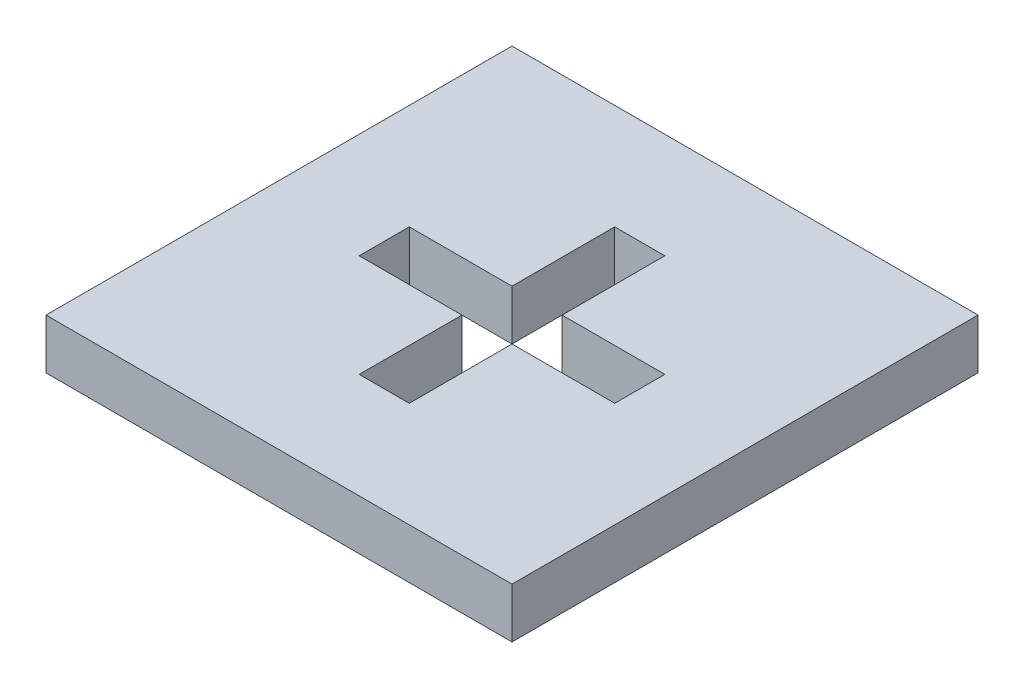
ISO-10303-21;
HEADER;
FILE_DESCRIPTION(('STEP AP214'),'2;1');
FILE_NAME('part.step','',(''),(''),'','','');
FILE_SCHEMA(('AUTOMOTIVE_DESIGN { 1 0 10303 214 1 1 1 1 }'));
ENDSEC;
DATA;
#1=APPLICATION_CONTEXT('core data for automotive mechanical design processes');
#2=APPLICATION_PROTOCOL_DEFINITION('international standard','automotive_design',2000,#1);
#3=PRODUCT_CONTEXT('',#1,'mechanical');
#4=PRODUCT('Part','Part','',(#3));
#5=PRODUCT_RELATED_PRODUCT_CATEGORY('part','',(#4));
#6=PRODUCT_DEFINITION_FORMATION('','',#4);
#7=PRODUCT_DEFINITION_CONTEXT('part definition',#1,'design');
#8=PRODUCT_DEFINITION('design','',#6,#7);
#9=PRODUCT_DEFINITION_SHAPE('','',#8);
#10=(LENGTH_UNIT() NAMED_UNIT(*) SI_UNIT(.MILLI.,.METRE.));
#11=(NAMED_UNIT(*) PLANE_ANGLE_UNIT() SI_UNIT($,.RADIAN.));
#12=(NAMED_UNIT(*) SI_UNIT($,.STERADIAN.) SOLID_ANGLE_UNIT());
#13=UNCERTAINTY_MEASURE_WITH_UNIT(LENGTH_MEASURE(1.E-05),#10,'distance_accuracy_value','');
#14=(GEOMETRIC_REPRESENTATION_CONTEXT(3) GLOBAL_UNCERTAINTY_ASSIGNED_CONTEXT((#13)) GLOBAL_UNIT_ASSIGNED_CONTEXT((#10,
#11,#12)) REPRESENTATION_CONTEXT('',''));
#15=CARTESIAN_POINT('',(0.,0.,0.));
#16=DIRECTION('',(0.,0.,1.));
#17=DIRECTION('',(1.,0.,0.));
#18=AXIS2_PLACEMENT_3D('',#15,#16,#17);
#19=CARTESIAN_POINT('',(0.,5.461,0.));
#20=DIRECTION('',(1.,0.,0.));
#21=DIRECTION('',(0.,0.,-1.));
#22=AXIS2_PLACEMENT_3D('',#19,#20,#21);
#23=PLANE('',#22);
#24=DIRECTION('',(0.,0.,1.));
#25=VECTOR('',#24,1.);
#26=CARTESIAN_POINT('',(0.,0.,0.));
#27=LINE('',#26,#25);
#28=CARTESIAN_POINT('',(0.,0.,-50.8));
#29=VERTEX_POINT('',#28);
#30=CARTESIAN_POINT('',(0.,0.,0.));
#31=VERTEX_POINT('',#30);
#32=EDGE_CURVE('E214',#29,#31,#27,.T.);
#33=ORIENTED_EDGE('',*,*,#32,.T.);
#34=DIRECTION('',(0.,-1.,0.));
#35=VECTOR('',#34,1.);
#36=CARTESIAN_POINT('',(0.,5.461,0.));
#37=LINE('',#36,#35);
#38=CARTESIAN_POINT('',(0.,5.461,0.));
#39=VERTEX_POINT('',#38);
#40=EDGE_CURVE('E12',#39,#31,#37,.T.);
#41=ORIENTED_EDGE('',*,*,#40,.F.);
#42=DIRECTION('',(0.,0.,1.));
#43=VECTOR('',#42,1.);
#44=CARTESIAN_POINT('',(0.,5.461,0.));
#45=LINE('',#44,#43);
#46=CARTESIAN_POINT('',(0.,5.461,-50.8));
#47=VERTEX_POINT('',#46);
#48=EDGE_CURVE('E234',#47,#39,#45,.T.);
#49=ORIENTED_EDGE('',*,*,#48,.F.);
#50=DIRECTION('',(0.,-1.,0.));
#51=VECTOR('',#50,1.);
#52=CARTESIAN_POINT('',(0.,5.461,-50.8));
#53=LINE('',#52,#51);
#54=EDGE_CURVE('E251',#47,#29,#53,.T.);
#55=ORIENTED_EDGE('',*,*,#54,.T.);
#56=EDGE_LOOP('',(#33,#41,#49,#55));
#57=FACE_BOUND('',#56,.T.);
#58=ADVANCED_FACE('F35',(#57),#23,.F.);
#59=CARTESIAN_POINT('',(0.,5.461,0.));
#60=DIRECTION('',(0.,0.,-1.));
#61=DIRECTION('',(-1.,0.,0.));
#62=AXIS2_PLACEMENT_3D('',#59,#60,#61);
#63=PLANE('',#62);
#64=DIRECTION('',(1.,0.,0.));
#65=VECTOR('',#64,1.);
#66=CARTESIAN_POINT('',(0.,0.,0.));
#67=LINE('',#66,#65);
#68=CARTESIAN_POINT('',(50.8,0.,0.));
#69=VERTEX_POINT('',#68);
#70=EDGE_CURVE('E254',#31,#69,#67,.T.);
#71=ORIENTED_EDGE('',*,*,#70,.T.);
#72=DIRECTION('',(0.,-1.,0.));
#73=VECTOR('',#72,1.);
#74=CARTESIAN_POINT('',(50.8,5.461,0.));
#75=LINE('',#74,#73);
#76=CARTESIAN_POINT('',(50.8,5.461,0.));
#77=VERTEX_POINT('',#76);
#78=EDGE_CURVE('E42',#77,#69,#75,.T.);
#79=ORIENTED_EDGE('',*,*,#78,.F.);
#80=DIRECTION('',(1.,0.,0.));
#81=VECTOR('',#80,1.);
#82=CARTESIAN_POINT('',(0.,5.461,0.));
#83=LINE('',#82,#81);
#84=EDGE_CURVE('E238',#39,#77,#83,.T.);
#85=ORIENTED_EDGE('',*,*,#84,.F.);
#86=ORIENTED_EDGE('',*,*,#40,.T.);
#87=EDGE_LOOP('',(#71,#79,#85,#86));
#88=FACE_BOUND('',#87,.T.);
#89=ADVANCED_FACE('F282',(#88),#63,.F.);
#90=CARTESIAN_POINT('',(50.8,5.461,0.));
#91=DIRECTION('',(-1.,0.,0.));
#92=DIRECTION('',(0.,0.,1.));
#93=AXIS2_PLACEMENT_3D('',#90,#91,#92);
#94=PLANE('',#93);
#95=DIRECTION('',(0.,0.,-1.));
#96=VECTOR('',#95,1.);
#97=CARTESIAN_POINT('',(50.8,0.,0.));
#98=LINE('',#97,#96);
#99=CARTESIAN_POINT('',(50.8,0.,-50.8));
#100=VERTEX_POINT('',#99);
#101=EDGE_CURVE('E256',#69,#100,#98,.T.);
#102=ORIENTED_EDGE('',*,*,#101,.T.);
#103=DIRECTION('',(0.,-1.,0.));
#104=VECTOR('',#103,1.);
#105=CARTESIAN_POINT('',(50.8,5.461,-50.8));
#106=LINE('',#105,#104);
#107=CARTESIAN_POINT('',(50.8,5.461,-50.8));
#108=VERTEX_POINT('',#107);
#109=EDGE_CURVE('E261',#108,#100,#106,.T.);
#110=ORIENTED_EDGE('',*,*,#109,.F.);
#111=DIRECTION('',(0.,0.,-1.));
#112=VECTOR('',#111,1.);
#113=CARTESIAN_POINT('',(50.8,5.461,0.));
#114=LINE('',#113,#112);
#115=EDGE_CURVE('E246',#77,#108,#114,.T.);
#116=ORIENTED_EDGE('',*,*,#115,.F.);
#117=ORIENTED_EDGE('',*,*,#78,.T.);
#118=EDGE_LOOP('',(#102,#110,#116,#117));
#119=FACE_BOUND('',#118,.T.);
#120=ADVANCED_FACE('F268',(#119),#94,.F.);
#121=CARTESIAN_POINT('',(0.,5.461,-50.8));
#122=DIRECTION('',(0.,0.,1.));
#123=DIRECTION('',(1.,0.,0.));
#124=AXIS2_PLACEMENT_3D('',#121,#122,#123);
#125=PLANE('',#124);
#126=DIRECTION('',(-1.,0.,0.));
#127=VECTOR('',#126,1.);
#128=CARTESIAN_POINT('',(0.,0.,-50.8));
#129=LINE('',#128,#127);
#130=EDGE_CURVE('E239',#100,#29,#129,.T.);
#131=ORIENTED_EDGE('',*,*,#130,.T.);
#132=ORIENTED_EDGE('',*,*,#54,.F.);
#133=DIRECTION('',(-1.,0.,0.));
#134=VECTOR('',#133,1.);
#135=CARTESIAN_POINT('',(0.,5.461,-50.8));
#136=LINE('',#135,#134);
#137=EDGE_CURVE('E248',#108,#47,#136,.T.);
#138=ORIENTED_EDGE('',*,*,#137,.F.);
#139=ORIENTED_EDGE('',*,*,#109,.T.);
#140=EDGE_LOOP('',(#131,#132,#138,#139));
#141=FACE_BOUND('',#140,.T.);
#142=ADVANCED_FACE('F275',(#141),#125,.F.);
#143=CARTESIAN_POINT('',(0.,5.461,0.));
#144=DIRECTION('',(0.,-1.,0.));
#145=DIRECTION('',(0.,0.,-1.));
#146=AXIS2_PLACEMENT_3D('',#143,#144,#145);
#147=PLANE('',#146);
#148=DIRECTION('',(-1.,0.,0.));
#149=VECTOR('',#148,1.);
#150=CARTESIAN_POINT('',(11.4723333333333,5.461,-28.1305));
#151=LINE('',#150,#149);
#152=CARTESIAN_POINT('',(22.6695,5.461,-28.1305));
#153=VERTEX_POINT('',#152);
#154=CARTESIAN_POINT('',(11.4723333333333,5.461,-28.1305));
#155=VERTEX_POINT('',#154);
#156=EDGE_CURVE('E199',#153,#155,#151,.T.);
#157=ORIENTED_EDGE('',*,*,#156,.F.);
#158=DIRECTION('',(0.,0.,1.));
#159=VECTOR('',#158,1.);
#160=CARTESIAN_POINT('',(22.6695,5.461,-39.3276666666666));
#161=LINE('',#160,#159);
#162=CARTESIAN_POINT('',(22.6695,5.461,-39.3276666666666));
#163=VERTEX_POINT('',#162);
#164=EDGE_CURVE('E49',#163,#153,#161,.T.);
#165=ORIENTED_EDGE('',*,*,#164,.F.);
#166=DIRECTION('',(-1.,0.,0.));
#167=VECTOR('',#166,1.);
#168=CARTESIAN_POINT('',(22.6695,5.461,-39.3276666666666));
#169=LINE('',#168,#167);
#170=CARTESIAN_POINT('',(28.1305,5.461,-39.3276666666666));
#171=VERTEX_POINT('',#170);
#172=EDGE_CURVE('E166',#171,#163,#169,.T.);
#173=ORIENTED_EDGE('',*,*,#172,.F.);
#174=DIRECTION('',(0.,0.,-1.));
#175=VECTOR('',#174,1.);
#176=CARTESIAN_POINT('',(28.1305,5.461,-39.3276666666666));
#177=LINE('',#176,#175);
#178=CARTESIAN_POINT('',(28.1305,5.461,-28.1305));
#179=VERTEX_POINT('',#178);
#180=EDGE_CURVE('E169',#179,#171,#177,.T.);
#181=ORIENTED_EDGE('',*,*,#180,.F.);
#182=DIRECTION('',(-1.,0.,0.));
#183=VECTOR('',#182,1.);
#184=CARTESIAN_POINT('',(28.1305,5.461,-28.1305));
#185=LINE('',#184,#183);
#186=CARTESIAN_POINT('',(39.3276666666667,5.461,-28.1305));
#187=VERTEX_POINT('',#186);
#188=EDGE_CURVE('E376',#187,#179,#185,.T.);
#189=ORIENTED_EDGE('',*,*,#188,.F.);
#190=DIRECTION('',(0.,0.,-1.));
#191=VECTOR('',#190,1.);
#192=CARTESIAN_POINT('',(39.3276666666667,5.461,-28.1305));
#193=LINE('',#192,#191);
#194=CARTESIAN_POINT('',(39.3276666666667,5.461,-22.6695));
#195=VERTEX_POINT('',#194);
#196=EDGE_CURVE('E373',#195,#187,#193,.T.);
#197=ORIENTED_EDGE('',*,*,#196,.F.);
#198=DIRECTION('',(1.,0.,0.));
#199=VECTOR('',#198,1.);
#200=CARTESIAN_POINT('',(28.1305,5.461,-22.6695));
#201=LINE('',#200,#199);
#202=CARTESIAN_POINT('',(28.1305,5.461,-22.6695));
#203=VERTEX_POINT('',#202);
#204=EDGE_CURVE('E369',#203,#195,#201,.T.);
#205=ORIENTED_EDGE('',*,*,#204,.F.);
#206=DIRECTION('',(0.,0.,-1.));
#207=VECTOR('',#206,1.);
#208=CARTESIAN_POINT('',(28.1305,5.461,-22.6695));
#209=LINE('',#208,#207);
#210=CARTESIAN_POINT('',(28.1305,5.461,-11.4723333333333));
#211=VERTEX_POINT('',#210);
#212=EDGE_CURVE('E365',#211,#203,#209,.T.);
#213=ORIENTED_EDGE('',*,*,#212,.F.);
#214=DIRECTION('',(1.,0.,0.));
#215=VECTOR('',#214,1.);
#216=CARTESIAN_POINT('',(22.6695,5.461,-11.4723333333333));
#217=LINE('',#216,#215);
#218=CARTESIAN_POINT('',(22.6695,5.461,-11.4723333333333));
#219=VERTEX_POINT('',#218);
#220=EDGE_CURVE('E362',#219,#211,#217,.T.);
#221=ORIENTED_EDGE('',*,*,#220,.F.);
#222=DIRECTION('',(0.,0.,1.));
#223=VECTOR('',#222,1.);
#224=CARTESIAN_POINT('',(22.6695,5.461,-22.6695));
#225=LINE('',#224,#223);
#226=CARTESIAN_POINT('',(22.6695,5.461,-22.6695));
#227=VERTEX_POINT('',#226);
#228=EDGE_CURVE('E350',#227,#219,#225,.T.);
#229=ORIENTED_EDGE('',*,*,#228,.F.);
#230=DIRECTION('',(1.,0.,0.));
#231=VECTOR('',#230,1.);
#232=CARTESIAN_POINT('',(11.4723333333333,5.461,-22.6695));
#233=LINE('',#232,#231);
#234=CARTESIAN_POINT('',(11.4723333333333,5.461,-22.6695));
#235=VERTEX_POINT('',#234);
#236=EDGE_CURVE('E348',#235,#227,#233,.T.);
#237=ORIENTED_EDGE('',*,*,#236,.F.);
#238=DIRECTION('',(0.,0.,1.));
#239=VECTOR('',#238,1.);
#240=CARTESIAN_POINT('',(11.4723333333333,5.461,-28.1305));
#241=LINE('',#240,#239);
#242=EDGE_CURVE('E347',#155,#235,#241,.T.);
#243=ORIENTED_EDGE('',*,*,#242,.F.);
#244=EDGE_LOOP('',(#157,#165,#173,#181,#189,#197,#205,#213,#221,#229,#237,#243));
#245=FACE_BOUND('',#244,.T.);
#246=ORIENTED_EDGE('',*,*,#48,.T.);
#247=ORIENTED_EDGE('',*,*,#84,.T.);
#248=ORIENTED_EDGE('',*,*,#115,.T.);
#249=ORIENTED_EDGE('',*,*,#137,.T.);
#250=EDGE_LOOP('',(#246,#247,#248,#249));
#251=FACE_BOUND('',#250,.T.);
#252=ADVANCED_FACE('F281',(#245,#251),#147,.F.);
#253=CARTESIAN_POINT('',(0.,0.,0.));
#254=DIRECTION('',(0.,-1.,0.));
#255=DIRECTION('',(0.,0.,-1.));
#256=AXIS2_PLACEMENT_3D('',#253,#254,#255);
#257=PLANE('',#256);
#258=DIRECTION('',(0.,0.,1.));
#259=VECTOR('',#258,1.);
#260=CARTESIAN_POINT('',(22.6695,0.,-39.3276666666666));
#261=LINE('',#260,#259);
#262=CARTESIAN_POINT('',(22.6695,0.,-39.3276666666666));
#263=VERTEX_POINT('',#262);
#264=CARTESIAN_POINT('',(22.6695,0.,-28.1305));
#265=VERTEX_POINT('',#264);
#266=EDGE_CURVE('E149',#263,#265,#261,.T.);
#267=ORIENTED_EDGE('',*,*,#266,.T.);
#268=DIRECTION('',(-1.,0.,0.));
#269=VECTOR('',#268,1.);
#270=CARTESIAN_POINT('',(11.4723333333333,0.,-28.1305));
#271=LINE('',#270,#269);
#272=CARTESIAN_POINT('',(11.4723333333333,0.,-28.1305));
#273=VERTEX_POINT('',#272);
#274=EDGE_CURVE('E158',#265,#273,#271,.T.);
#275=ORIENTED_EDGE('',*,*,#274,.T.);
#276=DIRECTION('',(0.,0.,1.));
#277=VECTOR('',#276,1.);
#278=CARTESIAN_POINT('',(11.4723333333333,0.,-28.1305));
#279=LINE('',#278,#277);
#280=CARTESIAN_POINT('',(11.4723333333333,0.,-22.6695));
#281=VERTEX_POINT('',#280);
#282=EDGE_CURVE('E57',#273,#281,#279,.T.);
#283=ORIENTED_EDGE('',*,*,#282,.T.);
#284=DIRECTION('',(1.,0.,0.));
#285=VECTOR('',#284,1.);
#286=CARTESIAN_POINT('',(11.4723333333333,0.,-22.6695));
#287=LINE('',#286,#285);
#288=CARTESIAN_POINT('',(22.6695,0.,-22.6695));
#289=VERTEX_POINT('',#288);
#290=EDGE_CURVE('E173',#281,#289,#287,.T.);
#291=ORIENTED_EDGE('',*,*,#290,.T.);
#292=DIRECTION('',(0.,0.,1.));
#293=VECTOR('',#292,1.);
#294=CARTESIAN_POINT('',(22.6695,0.,-22.6695));
#295=LINE('',#294,#293);
#296=CARTESIAN_POINT('',(22.6695,0.,-11.4723333333333));
#297=VERTEX_POINT('',#296);
#298=EDGE_CURVE('E176',#289,#297,#295,.T.);
#299=ORIENTED_EDGE('',*,*,#298,.T.);
#300=DIRECTION('',(1.,0.,0.));
#301=VECTOR('',#300,1.);
#302=CARTESIAN_POINT('',(22.6695,0.,-11.4723333333333));
#303=LINE('',#302,#301);
#304=CARTESIAN_POINT('',(28.1305,0.,-11.4723333333333));
#305=VERTEX_POINT('',#304);
#306=EDGE_CURVE('E179',#297,#305,#303,.T.);
#307=ORIENTED_EDGE('',*,*,#306,.T.);
#308=DIRECTION('',(0.,0.,-1.));
#309=VECTOR('',#308,1.);
#310=CARTESIAN_POINT('',(28.1305,0.,-22.6695));
#311=LINE('',#310,#309);
#312=CARTESIAN_POINT('',(28.1305,0.,-22.6695));
#313=VERTEX_POINT('',#312);
#314=EDGE_CURVE('E182',#305,#313,#311,.T.);
#315=ORIENTED_EDGE('',*,*,#314,.T.);
#316=DIRECTION('',(1.,0.,0.));
#317=VECTOR('',#316,1.);
#318=CARTESIAN_POINT('',(28.1305,0.,-22.6695));
#319=LINE('',#318,#317);
#320=CARTESIAN_POINT('',(39.3276666666667,0.,-22.6695));
#321=VERTEX_POINT('',#320);
#322=EDGE_CURVE('E185',#313,#321,#319,.T.);
#323=ORIENTED_EDGE('',*,*,#322,.T.);
#324=DIRECTION('',(0.,0.,-1.));
#325=VECTOR('',#324,1.);
#326=CARTESIAN_POINT('',(39.3276666666667,0.,-28.1305));
#327=LINE('',#326,#325);
#328=CARTESIAN_POINT('',(39.3276666666667,0.,-28.1305));
#329=VERTEX_POINT('',#328);
#330=EDGE_CURVE('E188',#321,#329,#327,.T.);
#331=ORIENTED_EDGE('',*,*,#330,.T.);
#332=DIRECTION('',(-1.,0.,0.));
#333=VECTOR('',#332,1.);
#334=CARTESIAN_POINT('',(28.1305,0.,-28.1305));
#335=LINE('',#334,#333);
#336=CARTESIAN_POINT('',(28.1305,0.,-28.1305));
#337=VERTEX_POINT('',#336);
#338=EDGE_CURVE('E191',#329,#337,#335,.T.);
#339=ORIENTED_EDGE('',*,*,#338,.T.);
#340=DIRECTION('',(0.,0.,-1.));
#341=VECTOR('',#340,1.);
#342=CARTESIAN_POINT('',(28.1305,0.,-39.3276666666666));
#343=LINE('',#342,#341);
#344=CARTESIAN_POINT('',(28.1305,0.,-39.3276666666666));
#345=VERTEX_POINT('',#344);
#346=EDGE_CURVE('E194',#337,#345,#343,.T.);
#347=ORIENTED_EDGE('',*,*,#346,.T.);
#348=DIRECTION('',(-1.,0.,0.));
#349=VECTOR('',#348,1.);
#350=CARTESIAN_POINT('',(22.6695,0.,-39.3276666666666));
#351=LINE('',#350,#349);
#352=EDGE_CURVE('E155',#345,#263,#351,.T.);
#353=ORIENTED_EDGE('',*,*,#352,.T.);
#354=EDGE_LOOP('',(#267,#275,#283,#291,#299,#307,#315,#323,#331,#339,#347,#353));
#355=FACE_BOUND('',#354,.T.);
#356=ORIENTED_EDGE('',*,*,#32,.F.);
#357=ORIENTED_EDGE('',*,*,#130,.F.);
#358=ORIENTED_EDGE('',*,*,#101,.F.);
#359=ORIENTED_EDGE('',*,*,#70,.F.);
#360=EDGE_LOOP('',(#356,#357,#358,#359));
#361=FACE_BOUND('',#360,.T.);
#362=ADVANCED_FACE('F162',(#355,#361),#257,.T.);
#363=CARTESIAN_POINT('',(22.6695,0.,-39.3276666666666));
#364=DIRECTION('',(-1.,0.,0.));
#365=DIRECTION('',(0.,0.,1.));
#366=AXIS2_PLACEMENT_3D('',#363,#364,#365);
#367=PLANE('',#366);
#368=ORIENTED_EDGE('',*,*,#164,.T.);
#369=DIRECTION('',(0.,1.,0.));
#370=VECTOR('',#369,1.);
#371=CARTESIAN_POINT('',(22.6695,0.,-28.1305));
#372=LINE('',#371,#370);
#373=EDGE_CURVE('E145',#265,#153,#372,.T.);
#374=ORIENTED_EDGE('',*,*,#373,.F.);
#375=ORIENTED_EDGE('',*,*,#266,.F.);
#376=DIRECTION('',(0.,1.,0.));
#377=VECTOR('',#376,1.);
#378=CARTESIAN_POINT('',(22.6695,0.,-39.3276666666666));
#379=LINE('',#378,#377);
#380=EDGE_CURVE('E212',#263,#163,#379,.T.);
#381=ORIENTED_EDGE('',*,*,#380,.T.);
#382=EDGE_LOOP('',(#368,#374,#375,#381));
#383=FACE_BOUND('',#382,.T.);
#384=ADVANCED_FACE('F147',(#383),#367,.F.);
#385=CARTESIAN_POINT('',(22.6695,0.,-39.3276666666666));
#386=DIRECTION('',(0.,0.,-1.));
#387=DIRECTION('',(-1.,0.,0.));
#388=AXIS2_PLACEMENT_3D('',#385,#386,#387);
#389=PLANE('',#388);
#390=ORIENTED_EDGE('',*,*,#172,.T.);
#391=ORIENTED_EDGE('',*,*,#380,.F.);
#392=ORIENTED_EDGE('',*,*,#352,.F.);
#393=DIRECTION('',(0.,1.,0.));
#394=VECTOR('',#393,1.);
#395=CARTESIAN_POINT('',(28.1305,0.,-39.3276666666666));
#396=LINE('',#395,#394);
#397=EDGE_CURVE('E215',#345,#171,#396,.T.);
#398=ORIENTED_EDGE('',*,*,#397,.T.);
#399=EDGE_LOOP('',(#390,#391,#392,#398));
#400=FACE_BOUND('',#399,.T.);
#401=ADVANCED_FACE('F299',(#400),#389,.F.);
#402=CARTESIAN_POINT('',(28.1305,0.,-39.3276666666666));
#403=DIRECTION('',(1.,0.,0.));
#404=DIRECTION('',(0.,0.,-1.));
#405=AXIS2_PLACEMENT_3D('',#402,#403,#404);
#406=PLANE('',#405);
#407=ORIENTED_EDGE('',*,*,#180,.T.);
#408=ORIENTED_EDGE('',*,*,#397,.F.);
#409=ORIENTED_EDGE('',*,*,#346,.F.);
#410=DIRECTION('',(0.,1.,0.));
#411=VECTOR('',#410,1.);
#412=CARTESIAN_POINT('',(28.1305,0.,-28.1305));
#413=LINE('',#412,#411);
#414=EDGE_CURVE('E217',#337,#179,#413,.T.);
#415=ORIENTED_EDGE('',*,*,#414,.T.);
#416=EDGE_LOOP('',(#407,#408,#409,#415));
#417=FACE_BOUND('',#416,.T.);
#418=ADVANCED_FACE('F332',(#417),#406,.F.);
#419=CARTESIAN_POINT('',(28.1305,0.,-28.1305));
#420=DIRECTION('',(0.,0.,-1.));
#421=DIRECTION('',(-1.,0.,0.));
#422=AXIS2_PLACEMENT_3D('',#419,#420,#421);
#423=PLANE('',#422);
#424=ORIENTED_EDGE('',*,*,#188,.T.);
#425=ORIENTED_EDGE('',*,*,#414,.F.);
#426=ORIENTED_EDGE('',*,*,#338,.F.);
#427=DIRECTION('',(0.,1.,0.));
#428=VECTOR('',#427,1.);
#429=CARTESIAN_POINT('',(39.3276666666667,0.,-28.1305));
#430=LINE('',#429,#428);
#431=EDGE_CURVE('E219',#329,#187,#430,.T.);
#432=ORIENTED_EDGE('',*,*,#431,.T.);
#433=EDGE_LOOP('',(#424,#425,#426,#432));
#434=FACE_BOUND('',#433,.T.);
#435=ADVANCED_FACE('F328',(#434),#423,.F.);
#436=CARTESIAN_POINT('',(39.3276666666667,0.,-28.1305));
#437=DIRECTION('',(1.,0.,0.));
#438=DIRECTION('',(0.,0.,-1.));
#439=AXIS2_PLACEMENT_3D('',#436,#437,#438);
#440=PLANE('',#439);
#441=ORIENTED_EDGE('',*,*,#196,.T.);
#442=ORIENTED_EDGE('',*,*,#431,.F.);
#443=ORIENTED_EDGE('',*,*,#330,.F.);
#444=DIRECTION('',(0.,1.,0.));
#445=VECTOR('',#444,1.);
#446=CARTESIAN_POINT('',(39.3276666666667,0.,-22.6695));
#447=LINE('',#446,#445);
#448=EDGE_CURVE('E221',#321,#195,#447,.T.);
#449=ORIENTED_EDGE('',*,*,#448,.T.);
#450=EDGE_LOOP('',(#441,#442,#443,#449));
#451=FACE_BOUND('',#450,.T.);
#452=ADVANCED_FACE('F324',(#451),#440,.F.);
#453=CARTESIAN_POINT('',(28.1305,0.,-22.6695));
#454=DIRECTION('',(0.,0.,1.));
#455=DIRECTION('',(1.,0.,0.));
#456=AXIS2_PLACEMENT_3D('',#453,#454,#455);
#457=PLANE('',#456);
#458=ORIENTED_EDGE('',*,*,#204,.T.);
#459=ORIENTED_EDGE('',*,*,#448,.F.);
#460=ORIENTED_EDGE('',*,*,#322,.F.);
#461=DIRECTION('',(0.,1.,0.));
#462=VECTOR('',#461,1.);
#463=CARTESIAN_POINT('',(28.1305,0.,-22.6695));
#464=LINE('',#463,#462);
#465=EDGE_CURVE('E223',#313,#203,#464,.T.);
#466=ORIENTED_EDGE('',*,*,#465,.T.);
#467=EDGE_LOOP('',(#458,#459,#460,#466));
#468=FACE_BOUND('',#467,.T.);
#469=ADVANCED_FACE('F320',(#468),#457,.F.);
#470=CARTESIAN_POINT('',(28.1305,0.,-22.6695));
#471=DIRECTION('',(1.,0.,0.));
#472=DIRECTION('',(0.,0.,-1.));
#473=AXIS2_PLACEMENT_3D('',#470,#471,#472);
#474=PLANE('',#473);
#475=ORIENTED_EDGE('',*,*,#212,.T.);
#476=ORIENTED_EDGE('',*,*,#465,.F.);
#477=ORIENTED_EDGE('',*,*,#314,.F.);
#478=DIRECTION('',(0.,1.,0.));
#479=VECTOR('',#478,1.);
#480=CARTESIAN_POINT('',(28.1305,0.,-11.4723333333333));
#481=LINE('',#480,#479);
#482=EDGE_CURVE('E225',#305,#211,#481,.T.);
#483=ORIENTED_EDGE('',*,*,#482,.T.);
#484=EDGE_LOOP('',(#475,#476,#477,#483));
#485=FACE_BOUND('',#484,.T.);
#486=ADVANCED_FACE('F316',(#485),#474,.F.);
#487=CARTESIAN_POINT('',(22.6695,0.,-11.4723333333333));
#488=DIRECTION('',(0.,0.,1.));
#489=DIRECTION('',(1.,0.,0.));
#490=AXIS2_PLACEMENT_3D('',#487,#488,#489);
#491=PLANE('',#490);
#492=ORIENTED_EDGE('',*,*,#220,.T.);
#493=ORIENTED_EDGE('',*,*,#482,.F.);
#494=ORIENTED_EDGE('',*,*,#306,.F.);
#495=DIRECTION('',(0.,1.,0.));
#496=VECTOR('',#495,1.);
#497=CARTESIAN_POINT('',(22.6695,0.,-11.4723333333333));
#498=LINE('',#497,#496);
#499=EDGE_CURVE('E227',#297,#219,#498,.T.);
#500=ORIENTED_EDGE('',*,*,#499,.T.);
#501=EDGE_LOOP('',(#492,#493,#494,#500));
#502=FACE_BOUND('',#501,.T.);
#503=ADVANCED_FACE('F312',(#502),#491,.F.);
#504=CARTESIAN_POINT('',(22.6695,0.,-22.6695));
#505=DIRECTION('',(-1.,0.,0.));
#506=DIRECTION('',(0.,0.,1.));
#507=AXIS2_PLACEMENT_3D('',#504,#505,#506);
#508=PLANE('',#507);
#509=ORIENTED_EDGE('',*,*,#228,.T.);
#510=ORIENTED_EDGE('',*,*,#499,.F.);
#511=ORIENTED_EDGE('',*,*,#298,.F.);
#512=DIRECTION('',(0.,1.,0.));
#513=VECTOR('',#512,1.);
#514=CARTESIAN_POINT('',(22.6695,0.,-22.6695));
#515=LINE('',#514,#513);
#516=EDGE_CURVE('E229',#289,#227,#515,.T.);
#517=ORIENTED_EDGE('',*,*,#516,.T.);
#518=EDGE_LOOP('',(#509,#510,#511,#517));
#519=FACE_BOUND('',#518,.T.);
#520=ADVANCED_FACE('F308',(#519),#508,.F.);
#521=CARTESIAN_POINT('',(11.4723333333333,0.,-22.6695));
#522=DIRECTION('',(0.,0.,1.));
#523=DIRECTION('',(1.,0.,0.));
#524=AXIS2_PLACEMENT_3D('',#521,#522,#523);
#525=PLANE('',#524);
#526=ORIENTED_EDGE('',*,*,#236,.T.);
#527=ORIENTED_EDGE('',*,*,#516,.F.);
#528=ORIENTED_EDGE('',*,*,#290,.F.);
#529=DIRECTION('',(0.,1.,0.));
#530=VECTOR('',#529,1.);
#531=CARTESIAN_POINT('',(11.4723333333333,0.,-22.6695));
#532=LINE('',#531,#530);
#533=EDGE_CURVE('E231',#281,#235,#532,.T.);
#534=ORIENTED_EDGE('',*,*,#533,.T.);
#535=EDGE_LOOP('',(#526,#527,#528,#534));
#536=FACE_BOUND('',#535,.T.);
#537=ADVANCED_FACE('F305',(#536),#525,.F.);
#538=CARTESIAN_POINT('',(11.4723333333333,0.,-28.1305));
#539=DIRECTION('',(-1.,0.,0.));
#540=DIRECTION('',(0.,0.,1.));
#541=AXIS2_PLACEMENT_3D('',#538,#539,#540);
#542=PLANE('',#541);
#543=ORIENTED_EDGE('',*,*,#242,.T.);
#544=ORIENTED_EDGE('',*,*,#533,.F.);
#545=ORIENTED_EDGE('',*,*,#282,.F.);
#546=DIRECTION('',(0.,1.,0.));
#547=VECTOR('',#546,1.);
#548=CARTESIAN_POINT('',(11.4723333333333,0.,-28.1305));
#549=LINE('',#548,#547);
#550=EDGE_CURVE('E154',#273,#155,#549,.T.);
#551=ORIENTED_EDGE('',*,*,#550,.T.);
#552=EDGE_LOOP('',(#543,#544,#545,#551));
#553=FACE_BOUND('',#552,.T.);
#554=ADVANCED_FACE('F302',(#553),#542,.F.);
#555=CARTESIAN_POINT('',(11.4723333333333,0.,-28.1305));
#556=DIRECTION('',(0.,0.,-1.));
#557=DIRECTION('',(-1.,0.,0.));
#558=AXIS2_PLACEMENT_3D('',#555,#556,#557);
#559=PLANE('',#558);
#560=ORIENTED_EDGE('',*,*,#156,.T.);
#561=ORIENTED_EDGE('',*,*,#550,.F.);
#562=ORIENTED_EDGE('',*,*,#274,.F.);
#563=ORIENTED_EDGE('',*,*,#373,.T.);
#564=EDGE_LOOP('',(#560,#561,#562,#563));
#565=FACE_BOUND('',#564,.T.);
#566=ADVANCED_FACE('F159',(#565),#559,.F.);
#567=CLOSED_SHELL('',(#58,#89,#120,#142,#252,#362,#384,#401,#418,#435,#452,#469,#486,#503,#520,
#537,#554,#566));
#568=MANIFOLD_SOLID_BREP('B2',#567);
#569=ADVANCED_BREP_SHAPE_REPRESENTATION('',(#18,#568),#14);
#570=SHAPE_DEFINITION_REPRESENTATION(#9,#569);
ENDSEC;
END-ISO-10303-21;
